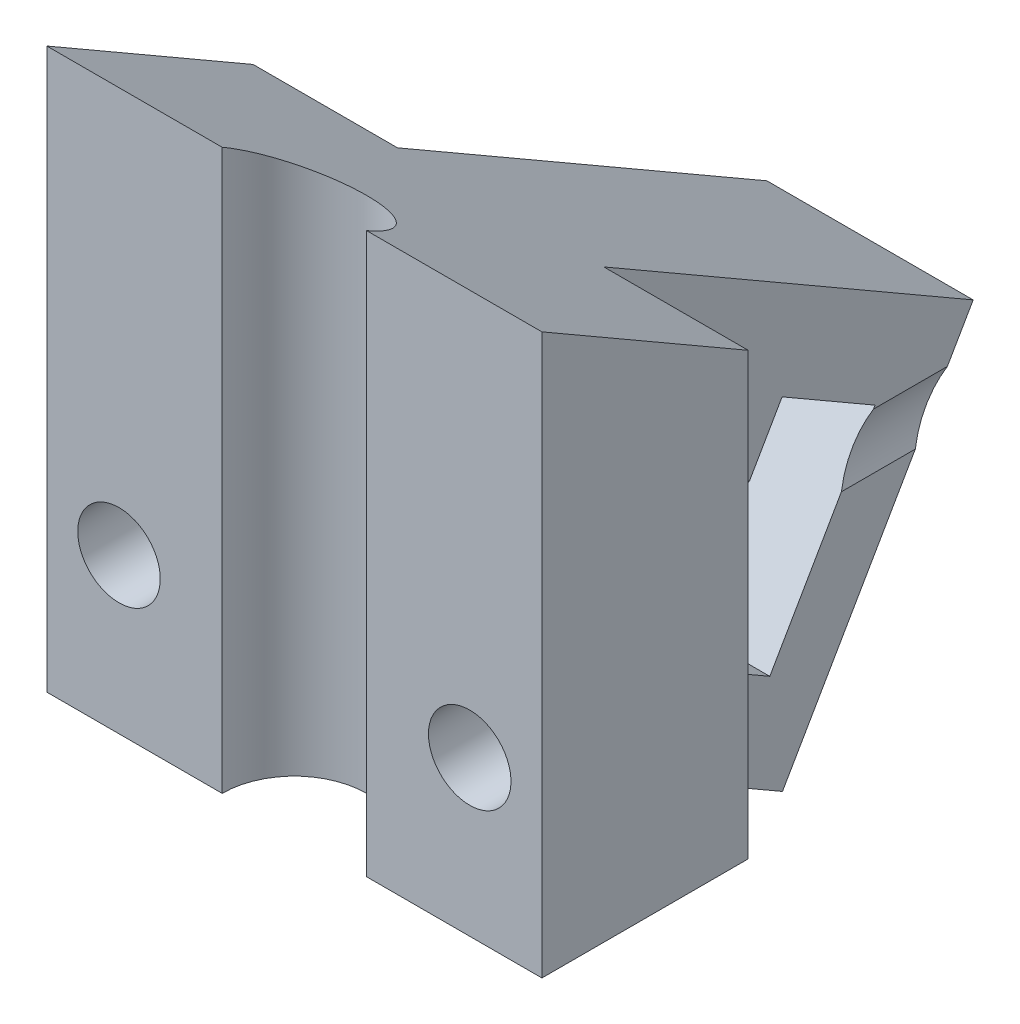
ISO-10303-21;
HEADER;
FILE_DESCRIPTION(('STEP AP214'),'2;1');
FILE_NAME('part.step','',(''),(''),'','','');
FILE_SCHEMA(('AUTOMOTIVE_DESIGN { 1 0 10303 214 1 1 1 1 }'));
ENDSEC;
DATA;
#1=APPLICATION_CONTEXT('core data for automotive mechanical design processes');
#2=APPLICATION_PROTOCOL_DEFINITION('international standard','automotive_design',2000,#1);
#3=PRODUCT_CONTEXT('',#1,'mechanical');
#4=PRODUCT('Part','Part','',(#3));
#5=PRODUCT_RELATED_PRODUCT_CATEGORY('part','',(#4));
#6=PRODUCT_DEFINITION_FORMATION('','',#4);
#7=PRODUCT_DEFINITION_CONTEXT('part definition',#1,'design');
#8=PRODUCT_DEFINITION('design','',#6,#7);
#9=PRODUCT_DEFINITION_SHAPE('','',#8);
#10=(LENGTH_UNIT() NAMED_UNIT(*) SI_UNIT(.MILLI.,.METRE.));
#11=(NAMED_UNIT(*) PLANE_ANGLE_UNIT() SI_UNIT($,.RADIAN.));
#12=(NAMED_UNIT(*) SI_UNIT($,.STERADIAN.) SOLID_ANGLE_UNIT());
#13=UNCERTAINTY_MEASURE_WITH_UNIT(LENGTH_MEASURE(1.E-05),#10,'distance_accuracy_value','');
#14=(GEOMETRIC_REPRESENTATION_CONTEXT(3) GLOBAL_UNCERTAINTY_ASSIGNED_CONTEXT((#13)) GLOBAL_UNIT_ASSIGNED_CONTEXT((#10,
#11,#12)) REPRESENTATION_CONTEXT('',''));
#15=CARTESIAN_POINT('',(0.,0.,0.));
#16=DIRECTION('',(0.,0.,1.));
#17=DIRECTION('',(1.,0.,0.));
#18=AXIS2_PLACEMENT_3D('',#15,#16,#17);
#19=CARTESIAN_POINT('',(-10.,0.,0.));
#20=DIRECTION('',(1.,0.,0.));
#21=DIRECTION('',(0.,0.,-1.));
#22=AXIS2_PLACEMENT_3D('',#19,#20,#21);
#23=PLANE('',#22);
#24=DIRECTION('',(0.,1.,0.));
#25=VECTOR('',#24,1.);
#26=CARTESIAN_POINT('',(-10.,0.,-10.));
#27=LINE('',#26,#25);
#28=CARTESIAN_POINT('',(-10.,17.6925824035673,-10.));
#29=VERTEX_POINT('',#28);
#30=CARTESIAN_POINT('',(-10.,42.7017059221719,-10.));
#31=VERTEX_POINT('',#30);
#32=EDGE_CURVE('E378',#29,#31,#27,.T.);
#33=ORIENTED_EDGE('',*,*,#32,.T.);
#34=DIRECTION('',(0.,-0.499999999999989,-0.866025403784445));
#35=VECTOR('',#34,1.);
#36=CARTESIAN_POINT('',(-10.,30.,-32.));
#37=LINE('',#36,#35);
#38=CARTESIAN_POINT('',(-10.,22.0262794416292,-45.810889132455));
#39=VERTEX_POINT('',#38);
#40=EDGE_CURVE('E382',#31,#39,#37,.T.);
#41=ORIENTED_EDGE('',*,*,#40,.T.);
#42=DIRECTION('',(0.,-0.866025403784445,0.499999999999989));
#43=VECTOR('',#42,1.);
#44=CARTESIAN_POINT('',(-10.,22.0262794416292,-45.810889132455));
#45=LINE('',#44,#43);
#46=CARTESIAN_POINT('',(-10.,17.6925824035673,-43.3088279809437));
#47=VERTEX_POINT('',#46);
#48=EDGE_CURVE('E385',#39,#47,#45,.T.);
#49=ORIENTED_EDGE('',*,*,#48,.T.);
#50=DIRECTION('',(0.,0.,1.));
#51=VECTOR('',#50,1.);
#52=CARTESIAN_POINT('',(-10.,17.6925824035673,-45.810889132455));
#53=LINE('',#52,#51);
#54=CARTESIAN_POINT('',(-10.,17.6925824035673,-36.1438041365583));
#55=VERTEX_POINT('',#54);
#56=EDGE_CURVE('E493',#55,#47,#53,.F.);
#57=ORIENTED_EDGE('',*,*,#56,.F.);
#58=DIRECTION('',(0.,-0.866025403784439,0.5));
#59=VECTOR('',#58,1.);
#60=CARTESIAN_POINT('',(-10.,0.282226936192982,-26.0919307207827));
#61=LINE('',#60,#59);
#62=CARTESIAN_POINT('',(-10.,17.9491451733955,-36.2919307207827));
#63=VERTEX_POINT('',#62);
#64=EDGE_CURVE('E348',#63,#55,#61,.T.);
#65=ORIENTED_EDGE('',*,*,#64,.F.);
#66=DIRECTION('',(0.,-0.5,-0.866025403784439));
#67=VECTOR('',#66,1.);
#68=CARTESIAN_POINT('',(-10.,23.1491451733955,-27.2852665214245));
#69=LINE('',#68,#67);
#70=CARTESIAN_POINT('',(-10.,23.1491451733955,-27.2852665214245));
#71=VERTEX_POINT('',#70);
#72=EDGE_CURVE('E344',#71,#63,#69,.T.);
#73=ORIENTED_EDGE('',*,*,#72,.F.);
#74=DIRECTION('',(0.,0.866025403784439,-0.5));
#75=VECTOR('',#74,1.);
#76=CARTESIAN_POINT('',(-10.,5.48222693619298,-17.0852665214245));
#77=LINE('',#76,#75);
#78=CARTESIAN_POINT('',(-10.,17.6925824035673,-24.1349185374141));
#79=VERTEX_POINT('',#78);
#80=EDGE_CURVE('E340',#79,#71,#77,.T.);
#81=ORIENTED_EDGE('',*,*,#80,.F.);
#82=EDGE_CURVE('E61',#29,#79,#53,.F.);
#83=ORIENTED_EDGE('',*,*,#82,.F.);
#84=EDGE_LOOP('',(#33,#41,#49,#57,#65,#73,#81,#83));
#85=FACE_BOUND('',#84,.T.);
#86=ADVANCED_FACE('F37',(#85),#23,.F.);
#87=CARTESIAN_POINT('',(10.,0.,0.));
#88=DIRECTION('',(1.,0.,0.));
#89=DIRECTION('',(0.,0.,-1.));
#90=AXIS2_PLACEMENT_3D('',#87,#88,#89);
#91=PLANE('',#90);
#92=DIRECTION('',(0.,0.499999999999989,0.866025403784445));
#93=VECTOR('',#92,1.);
#94=CARTESIAN_POINT('',(10.,30.,-32.));
#95=LINE('',#94,#93);
#96=CARTESIAN_POINT('',(10.,22.0262794416292,-45.810889132455));
#97=VERTEX_POINT('',#96);
#98=CARTESIAN_POINT('',(10.,42.7017059221719,-10.));
#99=VERTEX_POINT('',#98);
#100=EDGE_CURVE('E228',#97,#99,#95,.T.);
#101=ORIENTED_EDGE('',*,*,#100,.T.);
#102=DIRECTION('',(0.,-1.,0.));
#103=VECTOR('',#102,1.);
#104=CARTESIAN_POINT('',(10.,0.,-10.));
#105=LINE('',#104,#103);
#106=CARTESIAN_POINT('',(10.,17.6925824035672,-10.));
#107=VERTEX_POINT('',#106);
#108=EDGE_CURVE('E233',#99,#107,#105,.T.);
#109=ORIENTED_EDGE('',*,*,#108,.T.);
#110=DIRECTION('',(0.,0.,1.));
#111=VECTOR('',#110,1.);
#112=CARTESIAN_POINT('',(10.,17.6925824035672,-45.810889132455));
#113=LINE('',#112,#111);
#114=CARTESIAN_POINT('',(10.,17.6925824035672,-24.1349185374141));
#115=VERTEX_POINT('',#114);
#116=EDGE_CURVE('E413',#107,#115,#113,.F.);
#117=ORIENTED_EDGE('',*,*,#116,.T.);
#118=DIRECTION('',(0.,-0.866025403784439,0.5));
#119=VECTOR('',#118,1.);
#120=CARTESIAN_POINT('',(10.,-6.02758068494246,-10.4400759930412));
#121=LINE('',#120,#119);
#122=CARTESIAN_POINT('',(10.,23.1491451733955,-27.2852665214245));
#123=VERTEX_POINT('',#122);
#124=EDGE_CURVE('E363',#123,#115,#121,.T.);
#125=ORIENTED_EDGE('',*,*,#124,.F.);
#126=DIRECTION('',(0.,0.5,0.866025403784439));
#127=VECTOR('',#126,1.);
#128=CARTESIAN_POINT('',(10.,29.176725858338,-16.8451905283834));
#129=LINE('',#128,#127);
#130=CARTESIAN_POINT('',(10.,17.9491451733955,-36.2919307207827));
#131=VERTEX_POINT('',#130);
#132=EDGE_CURVE('E366',#131,#123,#129,.T.);
#133=ORIENTED_EDGE('',*,*,#132,.F.);
#134=DIRECTION('',(0.,0.866025403784439,-0.5));
#135=VECTOR('',#134,1.);
#136=CARTESIAN_POINT('',(10.,-11.2275806849425,-19.4467401923993));
#137=LINE('',#136,#135);
#138=CARTESIAN_POINT('',(10.,17.6925824035672,-36.1438041365583));
#139=VERTEX_POINT('',#138);
#140=EDGE_CURVE('E369',#139,#131,#137,.T.);
#141=ORIENTED_EDGE('',*,*,#140,.F.);
#142=CARTESIAN_POINT('',(10.,17.6925824035672,-43.3088279809437));
#143=VERTEX_POINT('',#142);
#144=EDGE_CURVE('E408',#139,#143,#113,.F.);
#145=ORIENTED_EDGE('',*,*,#144,.T.);
#146=DIRECTION('',(0.,0.866025403784445,-0.499999999999989));
#147=VECTOR('',#146,1.);
#148=CARTESIAN_POINT('',(10.,22.0262794416292,-45.810889132455));
#149=LINE('',#148,#147);
#150=EDGE_CURVE('E237',#143,#97,#149,.T.);
#151=ORIENTED_EDGE('',*,*,#150,.T.);
#152=EDGE_LOOP('',(#101,#109,#117,#125,#133,#141,#145,#151));
#153=FACE_BOUND('',#152,.T.);
#154=ADVANCED_FACE('F230',(#153),#91,.T.);
#155=CARTESIAN_POINT('',(-24.,30.,10.));
#156=DIRECTION('',(0.,0.,-1.));
#157=DIRECTION('',(-1.,0.,0.));
#158=AXIS2_PLACEMENT_3D('',#155,#156,#157);
#159=PLANE('',#158);
#160=CARTESIAN_POINT('',(17.,15.,10.));
#161=DIRECTION('',(0.,0.,-1.));
#162=DIRECTION('',(-1.,0.,0.));
#163=AXIS2_PLACEMENT_3D('',#160,#161,#162);
#164=CIRCLE('',#163,4.);
#165=CARTESIAN_POINT('',(13.,15.,10.));
#166=VERTEX_POINT('',#165);
#167=EDGE_CURVE('E302',#166,#166,#164,.T.);
#168=ORIENTED_EDGE('',*,*,#167,.T.);
#169=EDGE_LOOP('',(#168));
#170=FACE_BOUND('',#169,.T.);
#171=DIRECTION('',(1.,0.,0.));
#172=VECTOR('',#171,1.);
#173=CARTESIAN_POINT('',(-24.,54.2487113059644,10.));
#174=LINE('',#173,#172);
#175=CARTESIAN_POINT('',(7.,54.2487113059644,10.));
#176=VERTEX_POINT('',#175);
#177=CARTESIAN_POINT('',(24.,54.2487113059644,10.));
#178=VERTEX_POINT('',#177);
#179=EDGE_CURVE('E577',#176,#178,#174,.T.);
#180=ORIENTED_EDGE('',*,*,#179,.F.);
#181=DIRECTION('',(0.,1.,0.));
#182=VECTOR('',#181,1.);
#183=CARTESIAN_POINT('',(7.,0.,10.));
#184=LINE('',#183,#182);
#185=CARTESIAN_POINT('',(7.,0.,10.));
#186=VERTEX_POINT('',#185);
#187=EDGE_CURVE('E269',#186,#176,#184,.T.);
#188=ORIENTED_EDGE('',*,*,#187,.F.);
#189=DIRECTION('',(1.,0.,0.));
#190=VECTOR('',#189,1.);
#191=CARTESIAN_POINT('',(-24.,0.,10.));
#192=LINE('',#191,#190);
#193=CARTESIAN_POINT('',(24.,0.,10.));
#194=VERTEX_POINT('',#193);
#195=EDGE_CURVE('E282',#186,#194,#192,.T.);
#196=ORIENTED_EDGE('',*,*,#195,.T.);
#197=DIRECTION('',(0.,-1.,0.));
#198=VECTOR('',#197,1.);
#199=CARTESIAN_POINT('',(24.,30.,10.));
#200=LINE('',#199,#198);
#201=EDGE_CURVE('E286',#178,#194,#200,.T.);
#202=ORIENTED_EDGE('',*,*,#201,.F.);
#203=EDGE_LOOP('',(#180,#188,#196,#202));
#204=FACE_BOUND('',#203,.T.);
#205=ADVANCED_FACE('F477',(#170,#204),#159,.F.);
#206=CARTESIAN_POINT('',(24.,30.,10.));
#207=DIRECTION('',(-1.,0.,0.));
#208=DIRECTION('',(0.,0.,1.));
#209=AXIS2_PLACEMENT_3D('',#206,#207,#208);
#210=PLANE('',#209);
#211=DIRECTION('',(0.,-0.499999999999998,-0.86602540378444));
#212=VECTOR('',#211,1.);
#213=CARTESIAN_POINT('',(24.,48.1865334794733,-0.500000000000011));
#214=LINE('',#213,#212);
#215=CARTESIAN_POINT('',(24.,42.7017059221719,-10.));
#216=VERTEX_POINT('',#215);
#217=EDGE_CURVE('E248',#178,#216,#214,.T.);
#218=ORIENTED_EDGE('',*,*,#217,.F.);
#219=ORIENTED_EDGE('',*,*,#201,.T.);
#220=DIRECTION('',(0.,0.,-1.));
#221=VECTOR('',#220,1.);
#222=CARTESIAN_POINT('',(24.,0.,10.));
#223=LINE('',#222,#221);
#224=CARTESIAN_POINT('',(24.,0.,-10.));
#225=VERTEX_POINT('',#224);
#226=EDGE_CURVE('E272',#194,#225,#223,.T.);
#227=ORIENTED_EDGE('',*,*,#226,.T.);
#228=DIRECTION('',(0.,-1.,0.));
#229=VECTOR('',#228,1.);
#230=CARTESIAN_POINT('',(24.,0.,-10.));
#231=LINE('',#230,#229);
#232=EDGE_CURVE('E262',#216,#225,#231,.T.);
#233=ORIENTED_EDGE('',*,*,#232,.F.);
#234=EDGE_LOOP('',(#218,#219,#227,#233));
#235=FACE_BOUND('',#234,.T.);
#236=ADVANCED_FACE('F565',(#235),#210,.F.);
#237=CARTESIAN_POINT('',(-24.,30.,10.));
#238=DIRECTION('',(1.,0.,0.));
#239=DIRECTION('',(0.,0.,-1.));
#240=AXIS2_PLACEMENT_3D('',#237,#238,#239);
#241=PLANE('',#240);
#242=DIRECTION('',(0.,0.499999999999998,0.86602540378444));
#243=VECTOR('',#242,1.);
#244=CARTESIAN_POINT('',(-24.,48.1865334794733,-0.500000000000011));
#245=LINE('',#244,#243);
#246=CARTESIAN_POINT('',(-24.,42.7017059221719,-10.));
#247=VERTEX_POINT('',#246);
#248=CARTESIAN_POINT('',(-24.,54.2487113059644,10.));
#249=VERTEX_POINT('',#248);
#250=EDGE_CURVE('E511',#247,#249,#245,.T.);
#251=ORIENTED_EDGE('',*,*,#250,.F.);
#252=DIRECTION('',(0.,1.,0.));
#253=VECTOR('',#252,1.);
#254=CARTESIAN_POINT('',(-24.,0.,-10.));
#255=LINE('',#254,#253);
#256=CARTESIAN_POINT('',(-24.,0.,-10.));
#257=VERTEX_POINT('',#256);
#258=EDGE_CURVE('E375',#257,#247,#255,.T.);
#259=ORIENTED_EDGE('',*,*,#258,.F.);
#260=DIRECTION('',(0.,0.,1.));
#261=VECTOR('',#260,1.);
#262=CARTESIAN_POINT('',(-24.,0.,10.));
#263=LINE('',#262,#261);
#264=CARTESIAN_POINT('',(-24.,0.,10.));
#265=VERTEX_POINT('',#264);
#266=EDGE_CURVE('E279',#257,#265,#263,.T.);
#267=ORIENTED_EDGE('',*,*,#266,.T.);
#268=DIRECTION('',(0.,-1.,0.));
#269=VECTOR('',#268,1.);
#270=CARTESIAN_POINT('',(-24.,30.,10.));
#271=LINE('',#270,#269);
#272=EDGE_CURVE('E288',#249,#265,#271,.T.);
#273=ORIENTED_EDGE('',*,*,#272,.F.);
#274=EDGE_LOOP('',(#251,#259,#267,#273));
#275=FACE_BOUND('',#274,.T.);
#276=ADVANCED_FACE('F568',(#275),#241,.F.);
#277=CARTESIAN_POINT('',(-17.,15.,10.));
#278=DIRECTION('',(0.,0.,-1.));
#279=DIRECTION('',(-1.,0.,0.));
#280=AXIS2_PLACEMENT_3D('',#277,#278,#279);
#281=CIRCLE('',#280,4.);
#282=CARTESIAN_POINT('',(-21.,15.,10.));
#283=VERTEX_POINT('',#282);
#284=EDGE_CURVE('E333',#283,#283,#281,.T.);
#285=ORIENTED_EDGE('',*,*,#284,.T.);
#286=EDGE_LOOP('',(#285));
#287=FACE_BOUND('',#286,.T.);
#288=DIRECTION('',(1.,0.,0.));
#289=VECTOR('',#288,1.);
#290=CARTESIAN_POINT('',(-24.,54.2487113059644,10.));
#291=LINE('',#290,#289);
#292=CARTESIAN_POINT('',(-7.,54.2487113059644,10.));
#293=VERTEX_POINT('',#292);
#294=EDGE_CURVE('E514',#249,#293,#291,.T.);
#295=ORIENTED_EDGE('',*,*,#294,.F.);
#296=ORIENTED_EDGE('',*,*,#272,.T.);
#297=CARTESIAN_POINT('',(-7.,0.,10.));
#298=VERTEX_POINT('',#297);
#299=EDGE_CURVE('E283',#265,#298,#192,.T.);
#300=ORIENTED_EDGE('',*,*,#299,.T.);
#301=DIRECTION('',(0.,-1.,0.));
#302=VECTOR('',#301,1.);
#303=CARTESIAN_POINT('',(-7.,30.,10.));
#304=LINE('',#303,#302);
#305=EDGE_CURVE('E266',#293,#298,#304,.T.);
#306=ORIENTED_EDGE('',*,*,#305,.F.);
#307=EDGE_LOOP('',(#295,#296,#300,#306));
#308=FACE_BOUND('',#307,.T.);
#309=ADVANCED_FACE('F567',(#287,#308),#159,.F.);
#310=CARTESIAN_POINT('',(10.,0.,-10.));
#311=DIRECTION('',(0.,0.,1.));
#312=DIRECTION('',(1.,0.,0.));
#313=AXIS2_PLACEMENT_3D('',#310,#311,#312);
#314=PLANE('',#313);
#315=CARTESIAN_POINT('',(17.,15.,-10.));
#316=DIRECTION('',(0.,0.,-1.));
#317=DIRECTION('',(-1.,0.,0.));
#318=AXIS2_PLACEMENT_3D('',#315,#316,#317);
#319=CIRCLE('',#318,4.);
#320=CARTESIAN_POINT('',(13.,15.,-10.));
#321=VERTEX_POINT('',#320);
#322=EDGE_CURVE('E296',#321,#321,#319,.T.);
#323=ORIENTED_EDGE('',*,*,#322,.F.);
#324=EDGE_LOOP('',(#323));
#325=FACE_BOUND('',#324,.T.);
#326=DIRECTION('',(-1.,0.,0.));
#327=VECTOR('',#326,1.);
#328=CARTESIAN_POINT('',(10.,42.7017059221719,-10.));
#329=LINE('',#328,#327);
#330=EDGE_CURVE('E245',#216,#99,#329,.T.);
#331=ORIENTED_EDGE('',*,*,#330,.F.);
#332=ORIENTED_EDGE('',*,*,#232,.T.);
#333=DIRECTION('',(-1.,0.,0.));
#334=VECTOR('',#333,1.);
#335=CARTESIAN_POINT('',(-24.,0.,-10.));
#336=LINE('',#335,#334);
#337=CARTESIAN_POINT('',(10.,0.,-10.));
#338=VERTEX_POINT('',#337);
#339=EDGE_CURVE('E276',#225,#338,#336,.T.);
#340=ORIENTED_EDGE('',*,*,#339,.T.);
#341=CARTESIAN_POINT('',(10.,12.3074175964328,-10.));
#342=VERTEX_POINT('',#341);
#343=EDGE_CURVE('E241',#342,#338,#105,.T.);
#344=ORIENTED_EDGE('',*,*,#343,.F.);
#345=CARTESIAN_POINT('',(17.,15.,-10.));
#346=DIRECTION('',(0.,0.,-1.));
#347=DIRECTION('',(-1.,0.,0.));
#348=AXIS2_PLACEMENT_3D('',#345,#346,#347);
#349=CIRCLE('',#348,7.5);
#350=EDGE_CURVE('E255',#342,#107,#349,.T.);
#351=ORIENTED_EDGE('',*,*,#350,.T.);
#352=ORIENTED_EDGE('',*,*,#108,.F.);
#353=EDGE_LOOP('',(#331,#332,#340,#344,#351,#352));
#354=FACE_BOUND('',#353,.T.);
#355=ADVANCED_FACE('F253',(#325,#354),#314,.F.);
#356=CARTESIAN_POINT('',(-10.,0.,-10.));
#357=DIRECTION('',(0.,0.,1.));
#358=DIRECTION('',(1.,0.,0.));
#359=AXIS2_PLACEMENT_3D('',#356,#357,#358);
#360=PLANE('',#359);
#361=CARTESIAN_POINT('',(-17.,15.,-10.));
#362=DIRECTION('',(0.,0.,-1.));
#363=DIRECTION('',(-1.,0.,0.));
#364=AXIS2_PLACEMENT_3D('',#361,#362,#363);
#365=CIRCLE('',#364,4.);
#366=CARTESIAN_POINT('',(-21.,15.,-10.));
#367=VERTEX_POINT('',#366);
#368=EDGE_CURVE('E331',#367,#367,#365,.T.);
#369=ORIENTED_EDGE('',*,*,#368,.F.);
#370=EDGE_LOOP('',(#369));
#371=FACE_BOUND('',#370,.T.);
#372=DIRECTION('',(-1.,0.,0.));
#373=VECTOR('',#372,1.);
#374=CARTESIAN_POINT('',(-10.,42.7017059221719,-10.));
#375=LINE('',#374,#373);
#376=EDGE_CURVE('E505',#31,#247,#375,.T.);
#377=ORIENTED_EDGE('',*,*,#376,.F.);
#378=ORIENTED_EDGE('',*,*,#32,.F.);
#379=CARTESIAN_POINT('',(-17.,15.,-10.));
#380=DIRECTION('',(0.,0.,-1.));
#381=DIRECTION('',(-1.,0.,0.));
#382=AXIS2_PLACEMENT_3D('',#379,#380,#381);
#383=CIRCLE('',#382,7.5);
#384=CARTESIAN_POINT('',(-10.,12.3074175964327,-10.));
#385=VERTEX_POINT('',#384);
#386=EDGE_CURVE('E510',#29,#385,#383,.T.);
#387=ORIENTED_EDGE('',*,*,#386,.T.);
#388=CARTESIAN_POINT('',(-10.,0.,-10.));
#389=VERTEX_POINT('',#388);
#390=EDGE_CURVE('E379',#389,#385,#27,.T.);
#391=ORIENTED_EDGE('',*,*,#390,.F.);
#392=DIRECTION('',(-1.,0.,0.));
#393=VECTOR('',#392,1.);
#394=CARTESIAN_POINT('',(-10.,0.,-10.));
#395=LINE('',#394,#393);
#396=EDGE_CURVE('E265',#389,#257,#395,.T.);
#397=ORIENTED_EDGE('',*,*,#396,.T.);
#398=ORIENTED_EDGE('',*,*,#258,.T.);
#399=EDGE_LOOP('',(#377,#378,#387,#391,#397,#398));
#400=FACE_BOUND('',#399,.T.);
#401=ADVANCED_FACE('F489',(#371,#400),#360,.F.);
#402=CARTESIAN_POINT('',(0.,0.,10.));
#403=DIRECTION('',(0.,1.,0.));
#404=DIRECTION('',(0.,0.,1.));
#405=AXIS2_PLACEMENT_3D('',#402,#403,#404);
#406=CYLINDRICAL_SURFACE('',#405,7.);
#407=CARTESIAN_POINT('',(0.,54.2487113059644,10.));
#408=DIRECTION('',(0.,0.86602540378444,-0.499999999999998));
#409=DIRECTION('',(0.,0.499999999999998,0.86602540378444));
#410=AXIS2_PLACEMENT_3D('',#407,#408,#409);
#411=ELLIPSE('',#410,8.08290376865475,7.);
#412=EDGE_CURVE('E858',#293,#176,#411,.F.);
#413=ORIENTED_EDGE('',*,*,#412,.F.);
#414=ORIENTED_EDGE('',*,*,#305,.T.);
#415=CARTESIAN_POINT('',(0.,0.,10.));
#416=DIRECTION('',(0.,-1.,0.));
#417=DIRECTION('',(0.,0.,-1.));
#418=AXIS2_PLACEMENT_3D('',#415,#416,#417);
#419=CIRCLE('',#418,7.);
#420=CARTESIAN_POINT('',(0.,0.,3.));
#421=VERTEX_POINT('',#420);
#422=EDGE_CURVE('E290',#421,#298,#419,.F.);
#423=ORIENTED_EDGE('',*,*,#422,.F.);
#424=DIRECTION('',(0.,1.,0.));
#425=VECTOR('',#424,1.);
#426=CARTESIAN_POINT('',(0.,0.,3.));
#427=LINE('',#426,#425);
#428=CARTESIAN_POINT('',(0.,30.,3.));
#429=VERTEX_POINT('',#428);
#430=EDGE_CURVE('E295',#421,#429,#427,.T.);
#431=ORIENTED_EDGE('',*,*,#430,.T.);
#432=ORIENTED_EDGE('',*,*,#430,.F.);
#433=CARTESIAN_POINT('',(0.,0.,10.));
#434=DIRECTION('',(0.,-1.,0.));
#435=DIRECTION('',(0.,0.,-1.));
#436=AXIS2_PLACEMENT_3D('',#433,#434,#435);
#437=CIRCLE('',#436,7.);
#438=EDGE_CURVE('E293',#186,#421,#437,.F.);
#439=ORIENTED_EDGE('',*,*,#438,.F.);
#440=ORIENTED_EDGE('',*,*,#187,.T.);
#441=EDGE_LOOP('',(#413,#414,#423,#431,#432,#439,#440));
#442=FACE_BOUND('',#441,.T.);
#443=ADVANCED_FACE('F39',(#442),#406,.F.);
#444=DIRECTION('',(0.,0.,1.));
#445=VECTOR('',#444,1.);
#446=CARTESIAN_POINT('',(-10.,12.3074175964327,-45.810889132455));
#447=LINE('',#446,#445);
#448=CARTESIAN_POINT('',(-10.,12.3074175964327,-40.1997016299142));
#449=VERTEX_POINT('',#448);
#450=CARTESIAN_POINT('',(-10.,12.3074175964327,-33.0346777855287));
#451=VERTEX_POINT('',#450);
#452=EDGE_CURVE('E54',#449,#451,#447,.T.);
#453=ORIENTED_EDGE('',*,*,#452,.F.);
#454=CARTESIAN_POINT('',(-10.,-9.99999999999977,-27.3205080756889));
#455=VERTEX_POINT('',#454);
#456=EDGE_CURVE('E384',#449,#455,#45,.T.);
#457=ORIENTED_EDGE('',*,*,#456,.T.);
#458=DIRECTION('',(0.,0.499999999999989,0.866025403784445));
#459=VECTOR('',#458,1.);
#460=CARTESIAN_POINT('',(-10.,-9.99999999999977,-27.3205080756889));
#461=LINE('',#460,#459);
#462=EDGE_CURVE('E376',#455,#389,#461,.T.);
#463=ORIENTED_EDGE('',*,*,#462,.T.);
#464=ORIENTED_EDGE('',*,*,#390,.T.);
#465=CARTESIAN_POINT('',(-10.,12.3074175964327,-21.0257921863845));
#466=VERTEX_POINT('',#465);
#467=EDGE_CURVE('E496',#466,#385,#447,.T.);
#468=ORIENTED_EDGE('',*,*,#467,.F.);
#469=CARTESIAN_POINT('',(-10.,5.48222693619298,-17.0852665214245));
#470=VERTEX_POINT('',#469);
#471=EDGE_CURVE('E341',#470,#466,#77,.T.);
#472=ORIENTED_EDGE('',*,*,#471,.F.);
#473=DIRECTION('',(0.,0.5,0.866025403784439));
#474=VECTOR('',#473,1.);
#475=CARTESIAN_POINT('',(-10.,5.48222693619298,-17.0852665214245));
#476=LINE('',#475,#474);
#477=CARTESIAN_POINT('',(-10.,0.282226936192982,-26.0919307207827));
#478=VERTEX_POINT('',#477);
#479=EDGE_CURVE('E336',#478,#470,#476,.T.);
#480=ORIENTED_EDGE('',*,*,#479,.F.);
#481=EDGE_CURVE('E347',#451,#478,#61,.T.);
#482=ORIENTED_EDGE('',*,*,#481,.F.);
#483=EDGE_LOOP('',(#453,#457,#463,#464,#468,#472,#480,#482));
#484=FACE_BOUND('',#483,.T.);
#485=ADVANCED_FACE('F473',(#484),#23,.F.);
#486=CARTESIAN_POINT('',(10.,-9.99999999999977,-27.3205080756889));
#487=VERTEX_POINT('',#486);
#488=CARTESIAN_POINT('',(10.,12.3074175964328,-40.1997016299142));
#489=VERTEX_POINT('',#488);
#490=EDGE_CURVE('E242',#487,#489,#149,.T.);
#491=ORIENTED_EDGE('',*,*,#490,.T.);
#492=DIRECTION('',(0.,0.,1.));
#493=VECTOR('',#492,1.);
#494=CARTESIAN_POINT('',(10.,12.3074175964328,-45.810889132455));
#495=LINE('',#494,#493);
#496=CARTESIAN_POINT('',(10.,12.3074175964328,-33.0346777855287));
#497=VERTEX_POINT('',#496);
#498=EDGE_CURVE('E398',#489,#497,#495,.T.);
#499=ORIENTED_EDGE('',*,*,#498,.T.);
#500=CARTESIAN_POINT('',(10.,0.282226936192982,-26.0919307207827));
#501=VERTEX_POINT('',#500);
#502=EDGE_CURVE('E370',#501,#497,#137,.T.);
#503=ORIENTED_EDGE('',*,*,#502,.F.);
#504=DIRECTION('',(0.,-0.5,-0.866025403784439));
#505=VECTOR('',#504,1.);
#506=CARTESIAN_POINT('',(10.,11.5098076211354,-6.64519052838336));
#507=LINE('',#506,#505);
#508=CARTESIAN_POINT('',(10.,5.48222693619298,-17.0852665214245));
#509=VERTEX_POINT('',#508);
#510=EDGE_CURVE('E373',#509,#501,#507,.T.);
#511=ORIENTED_EDGE('',*,*,#510,.F.);
#512=CARTESIAN_POINT('',(10.,12.3074175964327,-21.0257921863845));
#513=VERTEX_POINT('',#512);
#514=EDGE_CURVE('E355',#513,#509,#121,.T.);
#515=ORIENTED_EDGE('',*,*,#514,.F.);
#516=EDGE_CURVE('E521',#513,#342,#495,.T.);
#517=ORIENTED_EDGE('',*,*,#516,.T.);
#518=ORIENTED_EDGE('',*,*,#343,.T.);
#519=DIRECTION('',(0.,-0.499999999999989,-0.866025403784445));
#520=VECTOR('',#519,1.);
#521=CARTESIAN_POINT('',(10.,-9.99999999999977,-27.3205080756889));
#522=LINE('',#521,#520);
#523=EDGE_CURVE('E264',#338,#487,#522,.T.);
#524=ORIENTED_EDGE('',*,*,#523,.T.);
#525=EDGE_LOOP('',(#491,#499,#503,#511,#515,#517,#518,#524));
#526=FACE_BOUND('',#525,.T.);
#527=ADVANCED_FACE('F396',(#526),#91,.T.);
#528=CARTESIAN_POINT('',(-24.,4.33012701892213,-2.49999999999989));
#529=DIRECTION('',(0.,-0.866025403784445,0.499999999999989));
#530=DIRECTION('',(0.,-0.499999999999989,-0.866025403784445));
#531=AXIS2_PLACEMENT_3D('',#528,#529,#530);
#532=PLANE('',#531);
#533=ORIENTED_EDGE('',*,*,#462,.F.);
#534=DIRECTION('',(1.,0.,0.));
#535=VECTOR('',#534,1.);
#536=CARTESIAN_POINT('',(-24.,-9.99999999999977,-27.3205080756889));
#537=LINE('',#536,#535);
#538=EDGE_CURVE('E256',#455,#487,#537,.T.);
#539=ORIENTED_EDGE('',*,*,#538,.T.);
#540=ORIENTED_EDGE('',*,*,#523,.F.);
#541=EDGE_CURVE('E275',#338,#389,#336,.T.);
#542=ORIENTED_EDGE('',*,*,#541,.T.);
#543=EDGE_LOOP('',(#533,#539,#540,#542));
#544=FACE_BOUND('',#543,.T.);
#545=ADVANCED_FACE('F488',(#544),#532,.T.);
#546=CARTESIAN_POINT('',(-24.,36.3564064605511,-20.990381056766));
#547=DIRECTION('',(0.,-0.866025403784445,0.499999999999989));
#548=DIRECTION('',(0.,-0.499999999999989,-0.866025403784445));
#549=AXIS2_PLACEMENT_3D('',#546,#547,#548);
#550=PLANE('',#549);
#551=DIRECTION('',(1.,0.,0.));
#552=VECTOR('',#551,1.);
#553=CARTESIAN_POINT('',(-24.,22.0262794416292,-45.810889132455));
#554=LINE('',#553,#552);
#555=EDGE_CURVE('E258',#39,#97,#554,.T.);
#556=ORIENTED_EDGE('',*,*,#555,.F.);
#557=ORIENTED_EDGE('',*,*,#40,.F.);
#558=ORIENTED_EDGE('',*,*,#376,.T.);
#559=ORIENTED_EDGE('',*,*,#250,.T.);
#560=ORIENTED_EDGE('',*,*,#294,.T.);
#561=ORIENTED_EDGE('',*,*,#412,.T.);
#562=ORIENTED_EDGE('',*,*,#179,.T.);
#563=ORIENTED_EDGE('',*,*,#217,.T.);
#564=ORIENTED_EDGE('',*,*,#330,.T.);
#565=ORIENTED_EDGE('',*,*,#100,.F.);
#566=EDGE_LOOP('',(#556,#557,#558,#559,#560,#561,#562,#563,#564,#565));
#567=FACE_BOUND('',#566,.T.);
#568=ADVANCED_FACE('F246',(#567),#550,.F.);
#569=CARTESIAN_POINT('',(-24.,-14.3301270189219,-24.820508075689));
#570=DIRECTION('',(0.,-0.499999999999988,-0.866025403784445));
#571=DIRECTION('',(0.,0.866025403784445,-0.499999999999988));
#572=AXIS2_PLACEMENT_3D('',#569,#570,#571);
#573=PLANE('',#572);
#574=DIRECTION('',(-1.,0.,0.));
#575=VECTOR('',#574,1.);
#576=CARTESIAN_POINT('',(2.76923076923077,6.01313972081475,-36.565698604072));
#577=LINE('',#576,#575);
#578=CARTESIAN_POINT('',(2.76923076923077,6.01313972081475,-36.565698604072));
#579=VERTEX_POINT('',#578);
#580=CARTESIAN_POINT('',(-2.15384615384615,6.01313972081475,-36.565698604072));
#581=VERTEX_POINT('',#580);
#582=EDGE_CURVE('E407',#579,#581,#577,.T.);
#583=ORIENTED_EDGE('',*,*,#582,.T.);
#584=DIRECTION('',(0.,-0.866025403784445,0.499999999999988));
#585=VECTOR('',#584,1.);
#586=CARTESIAN_POINT('',(-2.15384615384615,6.01313972081475,-36.565698604072));
#587=LINE('',#586,#585);
#588=CARTESIAN_POINT('',(-2.15384615384615,-0.915063509460814,-32.5656986040721));
#589=VERTEX_POINT('',#588);
#590=EDGE_CURVE('E410',#581,#589,#587,.T.);
#591=ORIENTED_EDGE('',*,*,#590,.T.);
#592=DIRECTION('',(1.,0.,0.));
#593=VECTOR('',#592,1.);
#594=CARTESIAN_POINT('',(-2.15384615384615,-0.915063509460814,-32.5656986040721));
#595=LINE('',#594,#593);
#596=CARTESIAN_POINT('',(-1.02564102564102,-0.915063509460816,-32.5656986040721));
#597=VERTEX_POINT('',#596);
#598=EDGE_CURVE('E434',#589,#597,#595,.T.);
#599=ORIENTED_EDGE('',*,*,#598,.T.);
#600=DIRECTION('',(0.,0.866025403784445,-0.499999999999988));
#601=VECTOR('',#600,1.);
#602=CARTESIAN_POINT('',(-1.02564102564102,-0.915063509460814,-32.5656986040721));
#603=LINE('',#602,#601);
#604=CARTESIAN_POINT('',(-1.02564102564102,5.21373165578296,-36.1041601425335));
#605=VERTEX_POINT('',#604);
#606=EDGE_CURVE('E436',#597,#605,#603,.T.);
#607=ORIENTED_EDGE('',*,*,#606,.T.);
#608=DIRECTION('',(1.,0.,0.));
#609=VECTOR('',#608,1.);
#610=CARTESIAN_POINT('',(-1.02564102564102,5.21373165578295,-36.1041601425335));
#611=LINE('',#610,#609);
#612=CARTESIAN_POINT('',(2.76923076923077,5.21373165578296,-36.1041601425335));
#613=VERTEX_POINT('',#612);
#614=EDGE_CURVE('E437',#605,#613,#611,.T.);
#615=ORIENTED_EDGE('',*,*,#614,.T.);
#616=DIRECTION('',(0.,0.866025403784445,-0.499999999999989));
#617=VECTOR('',#616,1.);
#618=CARTESIAN_POINT('',(2.76923076923077,5.21373165578295,-36.1041601425335));
#619=LINE('',#618,#617);
#620=EDGE_CURVE('E315',#613,#579,#619,.T.);
#621=ORIENTED_EDGE('',*,*,#620,.T.);
#622=EDGE_LOOP('',(#583,#591,#599,#607,#615,#621));
#623=FACE_BOUND('',#622,.T.);
#624=ORIENTED_EDGE('',*,*,#456,.F.);
#625=CARTESIAN_POINT('',(-17.,15.,-41.754264805429));
#626=DIRECTION('',(0.,-0.499999999999988,-0.866025403784445));
#627=DIRECTION('',(0.,-0.866025403784445,0.499999999999988));
#628=AXIS2_PLACEMENT_3D('',#625,#626,#627);
#629=ELLIPSE('',#628,8.66025403784432,7.5);
#630=EDGE_CURVE('E499',#449,#47,#629,.F.);
#631=ORIENTED_EDGE('',*,*,#630,.T.);
#632=ORIENTED_EDGE('',*,*,#48,.F.);
#633=ORIENTED_EDGE('',*,*,#555,.T.);
#634=ORIENTED_EDGE('',*,*,#150,.F.);
#635=CARTESIAN_POINT('',(17.,15.,-41.754264805429));
#636=DIRECTION('',(0.,-0.499999999999988,-0.866025403784445));
#637=DIRECTION('',(0.,-0.866025403784445,0.499999999999988));
#638=AXIS2_PLACEMENT_3D('',#635,#636,#637);
#639=ELLIPSE('',#638,8.66025403784432,7.5);
#640=EDGE_CURVE('E405',#143,#489,#639,.F.);
#641=ORIENTED_EDGE('',*,*,#640,.T.);
#642=ORIENTED_EDGE('',*,*,#490,.F.);
#643=ORIENTED_EDGE('',*,*,#538,.F.);
#644=EDGE_LOOP('',(#624,#631,#632,#633,#634,#641,#642,#643));
#645=FACE_BOUND('',#644,.T.);
#646=ADVANCED_FACE('F404',(#623,#645),#573,.T.);
#647=CARTESIAN_POINT('',(0.,0.,0.));
#648=DIRECTION('',(0.,-1.,0.));
#649=DIRECTION('',(0.,0.,-1.));
#650=AXIS2_PLACEMENT_3D('',#647,#648,#649);
#651=PLANE('',#650);
#652=ORIENTED_EDGE('',*,*,#195,.F.);
#653=ORIENTED_EDGE('',*,*,#438,.T.);
#654=ORIENTED_EDGE('',*,*,#422,.T.);
#655=ORIENTED_EDGE('',*,*,#299,.F.);
#656=ORIENTED_EDGE('',*,*,#266,.F.);
#657=ORIENTED_EDGE('',*,*,#396,.F.);
#658=ORIENTED_EDGE('',*,*,#541,.F.);
#659=ORIENTED_EDGE('',*,*,#339,.F.);
#660=ORIENTED_EDGE('',*,*,#226,.F.);
#661=EDGE_LOOP('',(#652,#653,#654,#655,#656,#657,#658,#659,#660));
#662=FACE_BOUND('',#661,.T.);
#663=ADVANCED_FACE('F548',(#662),#651,.T.);
#664=CARTESIAN_POINT('',(24.,5.48222693619298,-17.0852665214245));
#665=DIRECTION('',(0.,-0.866025403784439,0.5));
#666=DIRECTION('',(0.,-0.5,-0.866025403784439));
#667=AXIS2_PLACEMENT_3D('',#664,#665,#666);
#668=PLANE('',#667);
#669=ORIENTED_EDGE('',*,*,#510,.T.);
#670=DIRECTION('',(-1.,0.,0.));
#671=VECTOR('',#670,1.);
#672=CARTESIAN_POINT('',(24.,0.282226936192982,-26.0919307207827));
#673=LINE('',#672,#671);
#674=EDGE_CURVE('E352',#501,#478,#673,.T.);
#675=ORIENTED_EDGE('',*,*,#674,.T.);
#676=ORIENTED_EDGE('',*,*,#479,.T.);
#677=DIRECTION('',(-1.,0.,0.));
#678=VECTOR('',#677,1.);
#679=CARTESIAN_POINT('',(24.,5.48222693619298,-17.0852665214245));
#680=LINE('',#679,#678);
#681=EDGE_CURVE('E351',#509,#470,#680,.T.);
#682=ORIENTED_EDGE('',*,*,#681,.F.);
#683=EDGE_LOOP('',(#669,#675,#676,#682));
#684=FACE_BOUND('',#683,.T.);
#685=ADVANCED_FACE('F562',(#684),#668,.F.);
#686=CARTESIAN_POINT('',(24.,0.282226936192982,-26.0919307207827));
#687=DIRECTION('',(0.,-0.5,-0.866025403784439));
#688=DIRECTION('',(0.,0.866025403784439,-0.5));
#689=AXIS2_PLACEMENT_3D('',#686,#687,#688);
#690=PLANE('',#689);
#691=CARTESIAN_POINT('',(-17.,15.,-34.5892409610435));
#692=DIRECTION('',(0.,-0.5,-0.866025403784439));
#693=DIRECTION('',(0.,-0.866025403784439,0.5));
#694=AXIS2_PLACEMENT_3D('',#691,#692,#693);
#695=ELLIPSE('',#694,8.66025403784439,7.5);
#696=EDGE_CURVE('E494',#451,#55,#695,.F.);
#697=ORIENTED_EDGE('',*,*,#696,.F.);
#698=ORIENTED_EDGE('',*,*,#481,.T.);
#699=ORIENTED_EDGE('',*,*,#674,.F.);
#700=ORIENTED_EDGE('',*,*,#502,.T.);
#701=CARTESIAN_POINT('',(17.,15.,-34.5892409610435));
#702=DIRECTION('',(0.,-0.5,-0.866025403784439));
#703=DIRECTION('',(0.,-0.866025403784439,0.5));
#704=AXIS2_PLACEMENT_3D('',#701,#702,#703);
#705=ELLIPSE('',#704,8.66025403784439,7.5);
#706=EDGE_CURVE('E416',#139,#497,#705,.F.);
#707=ORIENTED_EDGE('',*,*,#706,.F.);
#708=ORIENTED_EDGE('',*,*,#140,.T.);
#709=DIRECTION('',(-1.,0.,0.));
#710=VECTOR('',#709,1.);
#711=CARTESIAN_POINT('',(24.,17.9491451733955,-36.2919307207827));
#712=LINE('',#711,#710);
#713=EDGE_CURVE('E356',#131,#63,#712,.T.);
#714=ORIENTED_EDGE('',*,*,#713,.T.);
#715=ORIENTED_EDGE('',*,*,#64,.T.);
#716=EDGE_LOOP('',(#697,#698,#699,#700,#707,#708,#714,#715));
#717=FACE_BOUND('',#716,.T.);
#718=ADVANCED_FACE('F528',(#717),#690,.F.);
#719=CARTESIAN_POINT('',(24.,23.1491451733955,-27.2852665214245));
#720=DIRECTION('',(0.,0.866025403784439,-0.5));
#721=DIRECTION('',(0.,0.5,0.866025403784439));
#722=AXIS2_PLACEMENT_3D('',#719,#720,#721);
#723=PLANE('',#722);
#724=ORIENTED_EDGE('',*,*,#132,.T.);
#725=DIRECTION('',(-1.,0.,0.));
#726=VECTOR('',#725,1.);
#727=CARTESIAN_POINT('',(24.,23.1491451733955,-27.2852665214245));
#728=LINE('',#727,#726);
#729=EDGE_CURVE('E358',#123,#71,#728,.T.);
#730=ORIENTED_EDGE('',*,*,#729,.T.);
#731=ORIENTED_EDGE('',*,*,#72,.T.);
#732=ORIENTED_EDGE('',*,*,#713,.F.);
#733=EDGE_LOOP('',(#724,#730,#731,#732));
#734=FACE_BOUND('',#733,.T.);
#735=ADVANCED_FACE('F533',(#734),#723,.F.);
#736=CARTESIAN_POINT('',(24.,5.48222693619298,-17.0852665214245));
#737=DIRECTION('',(0.,0.5,0.866025403784439));
#738=DIRECTION('',(0.,-0.866025403784439,0.5));
#739=AXIS2_PLACEMENT_3D('',#736,#737,#738);
#740=PLANE('',#739);
#741=CARTESIAN_POINT('',(-17.,15.,-22.5803553618993));
#742=DIRECTION('',(0.,0.5,0.866025403784439));
#743=DIRECTION('',(0.,-0.866025403784439,0.5));
#744=AXIS2_PLACEMENT_3D('',#741,#742,#743);
#745=ELLIPSE('',#744,8.66025403784438,7.5);
#746=EDGE_CURVE('E11',#79,#466,#745,.F.);
#747=ORIENTED_EDGE('',*,*,#746,.F.);
#748=ORIENTED_EDGE('',*,*,#80,.T.);
#749=ORIENTED_EDGE('',*,*,#729,.F.);
#750=ORIENTED_EDGE('',*,*,#124,.T.);
#751=CARTESIAN_POINT('',(17.,15.,-22.5803553618993));
#752=DIRECTION('',(0.,0.5,0.866025403784439));
#753=DIRECTION('',(0.,-0.866025403784439,0.5));
#754=AXIS2_PLACEMENT_3D('',#751,#752,#753);
#755=ELLIPSE('',#754,8.66025403784438,7.5);
#756=EDGE_CURVE('E46',#513,#115,#755,.F.);
#757=ORIENTED_EDGE('',*,*,#756,.F.);
#758=ORIENTED_EDGE('',*,*,#514,.T.);
#759=ORIENTED_EDGE('',*,*,#681,.T.);
#760=ORIENTED_EDGE('',*,*,#471,.T.);
#761=EDGE_LOOP('',(#747,#748,#749,#750,#757,#758,#759,#760));
#762=FACE_BOUND('',#761,.T.);
#763=ADVANCED_FACE('F537',(#762),#740,.F.);
#764=CARTESIAN_POINT('',(-17.,15.,10.));
#765=DIRECTION('',(0.,0.,-1.));
#766=DIRECTION('',(-1.,0.,0.));
#767=AXIS2_PLACEMENT_3D('',#764,#765,#766);
#768=CYLINDRICAL_SURFACE('',#767,4.);
#769=ORIENTED_EDGE('',*,*,#284,.F.);
#770=EDGE_LOOP('',(#769));
#771=FACE_BOUND('',#770,.T.);
#772=ORIENTED_EDGE('',*,*,#368,.T.);
#773=EDGE_LOOP('',(#772));
#774=FACE_BOUND('',#773,.T.);
#775=ADVANCED_FACE('F598',(#771,#774),#768,.F.);
#776=CARTESIAN_POINT('',(17.,15.,10.));
#777=DIRECTION('',(0.,0.,-1.));
#778=DIRECTION('',(-1.,0.,0.));
#779=AXIS2_PLACEMENT_3D('',#776,#777,#778);
#780=CYLINDRICAL_SURFACE('',#779,4.);
#781=ORIENTED_EDGE('',*,*,#167,.F.);
#782=EDGE_LOOP('',(#781));
#783=FACE_BOUND('',#782,.T.);
#784=ORIENTED_EDGE('',*,*,#322,.T.);
#785=EDGE_LOOP('',(#784));
#786=FACE_BOUND('',#785,.T.);
#787=ADVANCED_FACE('F603',(#783,#786),#780,.F.);
#788=CARTESIAN_POINT('',(2.76923076923077,5.51313972081476,-37.4317240078564));
#789=DIRECTION('',(0.,0.866025403784445,-0.499999999999989));
#790=DIRECTION('',(0.,0.499999999999989,0.866025403784445));
#791=AXIS2_PLACEMENT_3D('',#788,#789,#790);
#792=PLANE('',#791);
#793=ORIENTED_EDGE('',*,*,#582,.F.);
#794=DIRECTION('',(0.,0.499999999999989,0.866025403784445));
#795=VECTOR('',#794,1.);
#796=CARTESIAN_POINT('',(2.76923076923077,5.51313972081476,-37.4317240078564));
#797=LINE('',#796,#795);
#798=CARTESIAN_POINT('',(2.76923076923077,5.51313972081476,-37.4317240078564));
#799=VERTEX_POINT('',#798);
#800=EDGE_CURVE('E297',#799,#579,#797,.T.);
#801=ORIENTED_EDGE('',*,*,#800,.F.);
#802=DIRECTION('',(-1.,0.,0.));
#803=VECTOR('',#802,1.);
#804=CARTESIAN_POINT('',(2.76923076923077,5.51313972081476,-37.4317240078564));
#805=LINE('',#804,#803);
#806=CARTESIAN_POINT('',(-2.15384615384615,5.51313972081476,-37.4317240078564));
#807=VERTEX_POINT('',#806);
#808=EDGE_CURVE('E417',#799,#807,#805,.T.);
#809=ORIENTED_EDGE('',*,*,#808,.T.);
#810=DIRECTION('',(0.,0.499999999999989,0.866025403784445));
#811=VECTOR('',#810,1.);
#812=CARTESIAN_POINT('',(-2.15384615384615,5.51313972081476,-37.4317240078564));
#813=LINE('',#812,#811);
#814=EDGE_CURVE('E326',#807,#581,#813,.T.);
#815=ORIENTED_EDGE('',*,*,#814,.T.);
#816=EDGE_LOOP('',(#793,#801,#809,#815));
#817=FACE_BOUND('',#816,.T.);
#818=ADVANCED_FACE('F452',(#817),#792,.T.);
#819=CARTESIAN_POINT('',(2.76923076923077,4.71373165578296,-36.970185546318));
#820=DIRECTION('',(1.,0.,0.));
#821=DIRECTION('',(0.,0.,-1.));
#822=AXIS2_PLACEMENT_3D('',#819,#820,#821);
#823=PLANE('',#822);
#824=ORIENTED_EDGE('',*,*,#620,.F.);
#825=DIRECTION('',(0.,0.499999999999989,0.866025403784445));
#826=VECTOR('',#825,1.);
#827=CARTESIAN_POINT('',(2.76923076923077,4.71373165578296,-36.970185546318));
#828=LINE('',#827,#826);
#829=CARTESIAN_POINT('',(2.76923076923077,4.71373165578296,-36.970185546318));
#830=VERTEX_POINT('',#829);
#831=EDGE_CURVE('E305',#830,#613,#828,.T.);
#832=ORIENTED_EDGE('',*,*,#831,.F.);
#833=DIRECTION('',(0.,0.866025403784445,-0.499999999999989));
#834=VECTOR('',#833,1.);
#835=CARTESIAN_POINT('',(2.76923076923077,4.71373165578296,-36.970185546318));
#836=LINE('',#835,#834);
#837=EDGE_CURVE('E329',#830,#799,#836,.T.);
#838=ORIENTED_EDGE('',*,*,#837,.T.);
#839=ORIENTED_EDGE('',*,*,#800,.T.);
#840=EDGE_LOOP('',(#824,#832,#838,#839));
#841=FACE_BOUND('',#840,.T.);
#842=ADVANCED_FACE('F440',(#841),#823,.T.);
#843=CARTESIAN_POINT('',(-1.02564102564102,4.71373165578296,-36.970185546318));
#844=DIRECTION('',(0.,-0.866025403784445,0.499999999999989));
#845=DIRECTION('',(0.,-0.499999999999989,-0.866025403784445));
#846=AXIS2_PLACEMENT_3D('',#843,#844,#845);
#847=PLANE('',#846);
#848=ORIENTED_EDGE('',*,*,#614,.F.);
#849=DIRECTION('',(0.,0.499999999999989,0.866025403784445));
#850=VECTOR('',#849,1.);
#851=CARTESIAN_POINT('',(-1.02564102564102,4.71373165578296,-36.970185546318));
#852=LINE('',#851,#850);
#853=CARTESIAN_POINT('',(-1.02564102564102,4.71373165578296,-36.970185546318));
#854=VERTEX_POINT('',#853);
#855=EDGE_CURVE('E312',#854,#605,#852,.T.);
#856=ORIENTED_EDGE('',*,*,#855,.F.);
#857=DIRECTION('',(1.,0.,0.));
#858=VECTOR('',#857,1.);
#859=CARTESIAN_POINT('',(-1.02564102564102,4.71373165578296,-36.970185546318));
#860=LINE('',#859,#858);
#861=EDGE_CURVE('E429',#854,#830,#860,.T.);
#862=ORIENTED_EDGE('',*,*,#861,.T.);
#863=ORIENTED_EDGE('',*,*,#831,.T.);
#864=EDGE_LOOP('',(#848,#856,#862,#863));
#865=FACE_BOUND('',#864,.T.);
#866=ADVANCED_FACE('F444',(#865),#847,.T.);
#867=CARTESIAN_POINT('',(-1.02564102564102,-1.4150635094608,-33.4317240078565));
#868=DIRECTION('',(1.,0.,0.));
#869=DIRECTION('',(0.,0.,-1.));
#870=AXIS2_PLACEMENT_3D('',#867,#868,#869);
#871=PLANE('',#870);
#872=ORIENTED_EDGE('',*,*,#606,.F.);
#873=DIRECTION('',(0.,0.499999999999989,0.866025403784445));
#874=VECTOR('',#873,1.);
#875=CARTESIAN_POINT('',(-1.02564102564102,-1.4150635094608,-33.4317240078565));
#876=LINE('',#875,#874);
#877=CARTESIAN_POINT('',(-1.02564102564102,-1.4150635094608,-33.4317240078565));
#878=VERTEX_POINT('',#877);
#879=EDGE_CURVE('E320',#878,#597,#876,.T.);
#880=ORIENTED_EDGE('',*,*,#879,.F.);
#881=DIRECTION('',(0.,0.866025403784445,-0.499999999999988));
#882=VECTOR('',#881,1.);
#883=CARTESIAN_POINT('',(-1.02564102564102,-1.4150635094608,-33.4317240078565));
#884=LINE('',#883,#882);
#885=EDGE_CURVE('E426',#878,#854,#884,.T.);
#886=ORIENTED_EDGE('',*,*,#885,.T.);
#887=ORIENTED_EDGE('',*,*,#855,.T.);
#888=EDGE_LOOP('',(#872,#880,#886,#887));
#889=FACE_BOUND('',#888,.T.);
#890=ADVANCED_FACE('F461',(#889),#871,.T.);
#891=CARTESIAN_POINT('',(-2.15384615384615,-1.4150635094608,-33.4317240078565));
#892=DIRECTION('',(0.,-0.866025403784445,0.499999999999989));
#893=DIRECTION('',(0.,-0.499999999999989,-0.866025403784445));
#894=AXIS2_PLACEMENT_3D('',#891,#892,#893);
#895=PLANE('',#894);
#896=ORIENTED_EDGE('',*,*,#598,.F.);
#897=DIRECTION('',(0.,0.499999999999989,0.866025403784445));
#898=VECTOR('',#897,1.);
#899=CARTESIAN_POINT('',(-2.15384615384615,-1.4150635094608,-33.4317240078565));
#900=LINE('',#899,#898);
#901=CARTESIAN_POINT('',(-2.15384615384615,-1.4150635094608,-33.4317240078565));
#902=VERTEX_POINT('',#901);
#903=EDGE_CURVE('E323',#902,#589,#900,.T.);
#904=ORIENTED_EDGE('',*,*,#903,.F.);
#905=DIRECTION('',(1.,0.,0.));
#906=VECTOR('',#905,1.);
#907=CARTESIAN_POINT('',(-2.15384615384615,-1.4150635094608,-33.4317240078565));
#908=LINE('',#907,#906);
#909=EDGE_CURVE('E423',#902,#878,#908,.T.);
#910=ORIENTED_EDGE('',*,*,#909,.T.);
#911=ORIENTED_EDGE('',*,*,#879,.T.);
#912=EDGE_LOOP('',(#896,#904,#910,#911));
#913=FACE_BOUND('',#912,.T.);
#914=ADVANCED_FACE('F459',(#913),#895,.T.);
#915=CARTESIAN_POINT('',(-2.15384615384615,5.51313972081476,-37.4317240078564));
#916=DIRECTION('',(-1.,0.,0.));
#917=DIRECTION('',(0.,0.,1.));
#918=AXIS2_PLACEMENT_3D('',#915,#916,#917);
#919=PLANE('',#918);
#920=ORIENTED_EDGE('',*,*,#590,.F.);
#921=ORIENTED_EDGE('',*,*,#814,.F.);
#922=DIRECTION('',(0.,-0.866025403784445,0.499999999999988));
#923=VECTOR('',#922,1.);
#924=CARTESIAN_POINT('',(-2.15384615384615,5.51313972081476,-37.4317240078564));
#925=LINE('',#924,#923);
#926=EDGE_CURVE('E420',#807,#902,#925,.T.);
#927=ORIENTED_EDGE('',*,*,#926,.T.);
#928=ORIENTED_EDGE('',*,*,#903,.T.);
#929=EDGE_LOOP('',(#920,#921,#927,#928));
#930=FACE_BOUND('',#929,.T.);
#931=ADVANCED_FACE('F455',(#930),#919,.T.);
#932=CARTESIAN_POINT('',(0.,-14.8301270189219,-25.6865334794735));
#933=DIRECTION('',(0.,0.499999999999988,0.866025403784445));
#934=DIRECTION('',(0.,-0.866025403784445,0.499999999999988));
#935=AXIS2_PLACEMENT_3D('',#932,#933,#934);
#936=PLANE('',#935);
#937=ORIENTED_EDGE('',*,*,#808,.F.);
#938=ORIENTED_EDGE('',*,*,#837,.F.);
#939=ORIENTED_EDGE('',*,*,#861,.F.);
#940=ORIENTED_EDGE('',*,*,#885,.F.);
#941=ORIENTED_EDGE('',*,*,#909,.F.);
#942=ORIENTED_EDGE('',*,*,#926,.F.);
#943=EDGE_LOOP('',(#937,#938,#939,#940,#941,#942));
#944=FACE_BOUND('',#943,.T.);
#945=ADVANCED_FACE('F448',(#944),#936,.F.);
#946=CARTESIAN_POINT('',(17.,15.,-45.810889132455));
#947=DIRECTION('',(0.,0.,1.));
#948=DIRECTION('',(1.,0.,0.));
#949=AXIS2_PLACEMENT_3D('',#946,#947,#948);
#950=CYLINDRICAL_SURFACE('',#949,7.5);
#951=ORIENTED_EDGE('',*,*,#350,.F.);
#952=ORIENTED_EDGE('',*,*,#516,.F.);
#953=ORIENTED_EDGE('',*,*,#756,.T.);
#954=ORIENTED_EDGE('',*,*,#116,.F.);
#955=EDGE_LOOP('',(#951,#952,#953,#954));
#956=FACE_BOUND('',#955,.T.);
#957=ADVANCED_FACE('F587',(#956),#950,.F.);
#958=ORIENTED_EDGE('',*,*,#144,.F.);
#959=ORIENTED_EDGE('',*,*,#706,.T.);
#960=ORIENTED_EDGE('',*,*,#498,.F.);
#961=ORIENTED_EDGE('',*,*,#640,.F.);
#962=EDGE_LOOP('',(#958,#959,#960,#961));
#963=FACE_BOUND('',#962,.T.);
#964=ADVANCED_FACE('F525',(#963),#950,.F.);
#965=CARTESIAN_POINT('',(-17.,15.,-45.810889132455));
#966=DIRECTION('',(0.,0.,1.));
#967=DIRECTION('',(1.,0.,0.));
#968=AXIS2_PLACEMENT_3D('',#965,#966,#967);
#969=CYLINDRICAL_SURFACE('',#968,7.5);
#970=ORIENTED_EDGE('',*,*,#82,.T.);
#971=ORIENTED_EDGE('',*,*,#746,.T.);
#972=ORIENTED_EDGE('',*,*,#467,.T.);
#973=ORIENTED_EDGE('',*,*,#386,.F.);
#974=EDGE_LOOP('',(#970,#971,#972,#973));
#975=FACE_BOUND('',#974,.T.);
#976=ADVANCED_FACE('F540',(#975),#969,.F.);
#977=ORIENTED_EDGE('',*,*,#452,.T.);
#978=ORIENTED_EDGE('',*,*,#696,.T.);
#979=ORIENTED_EDGE('',*,*,#56,.T.);
#980=ORIENTED_EDGE('',*,*,#630,.F.);
#981=EDGE_LOOP('',(#977,#978,#979,#980));
#982=FACE_BOUND('',#981,.T.);
#983=ADVANCED_FACE('F704',(#982),#969,.F.);
#984=CLOSED_SHELL('',(#86,#154,#205,#236,#276,#309,#355,#401,#443,#485,#527,#545,#568,#646,#663,
#685,#718,#735,#763,#775,#787,#818,#842,#866,#890,#914,#931,#945,#957,#964,#976,#983));
#985=MANIFOLD_SOLID_BREP('B2',#984);
#986=ADVANCED_BREP_SHAPE_REPRESENTATION('',(#18,#985),#14);
#987=SHAPE_DEFINITION_REPRESENTATION(#9,#986);
ENDSEC;
END-ISO-10303-21;
